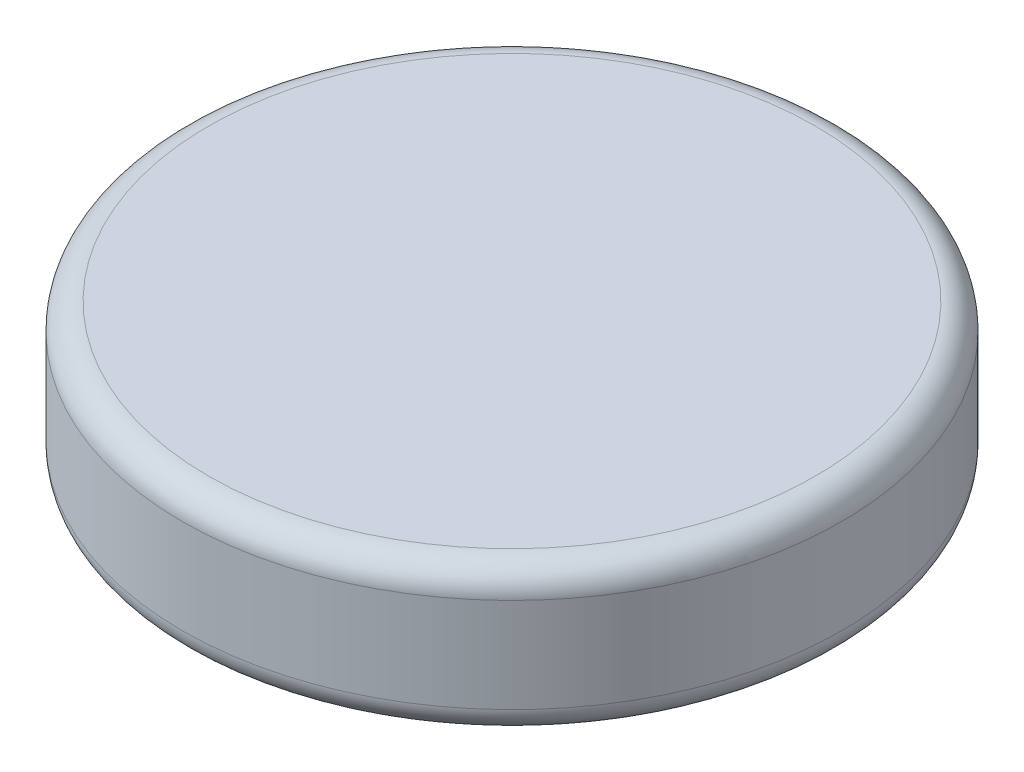
ISO-10303-21;
HEADER;
FILE_DESCRIPTION(('STEP AP214'),'2;1');
FILE_NAME('part.step','',(''),(''),'','','');
FILE_SCHEMA(('AUTOMOTIVE_DESIGN { 1 0 10303 214 1 1 1 1 }'));
ENDSEC;
DATA;
#1=APPLICATION_CONTEXT('core data for automotive mechanical design processes');
#2=APPLICATION_PROTOCOL_DEFINITION('international standard','automotive_design',2000,#1);
#3=PRODUCT_CONTEXT('',#1,'mechanical');
#4=PRODUCT('Part','Part','',(#3));
#5=PRODUCT_RELATED_PRODUCT_CATEGORY('part','',(#4));
#6=PRODUCT_DEFINITION_FORMATION('','',#4);
#7=PRODUCT_DEFINITION_CONTEXT('part definition',#1,'design');
#8=PRODUCT_DEFINITION('design','',#6,#7);
#9=PRODUCT_DEFINITION_SHAPE('','',#8);
#10=(LENGTH_UNIT() NAMED_UNIT(*) SI_UNIT(.MILLI.,.METRE.));
#11=(NAMED_UNIT(*) PLANE_ANGLE_UNIT() SI_UNIT($,.RADIAN.));
#12=(NAMED_UNIT(*) SI_UNIT($,.STERADIAN.) SOLID_ANGLE_UNIT());
#13=UNCERTAINTY_MEASURE_WITH_UNIT(LENGTH_MEASURE(1.E-05),#10,'distance_accuracy_value','');
#14=(GEOMETRIC_REPRESENTATION_CONTEXT(3) GLOBAL_UNCERTAINTY_ASSIGNED_CONTEXT((#13)) GLOBAL_UNIT_ASSIGNED_CONTEXT((#10,
#11,#12)) REPRESENTATION_CONTEXT('',''));
#15=CARTESIAN_POINT('',(0.,0.,0.));
#16=DIRECTION('',(0.,0.,1.));
#17=DIRECTION('',(1.,0.,0.));
#18=AXIS2_PLACEMENT_3D('',#15,#16,#17);
#19=CARTESIAN_POINT('',(0.,7.112,0.));
#20=DIRECTION('',(0.,-1.,0.));
#21=DIRECTION('',(0.,0.,-1.));
#22=AXIS2_PLACEMENT_3D('',#19,#20,#21);
#23=CYLINDRICAL_SURFACE('',#22,15.9385);
#24=CARTESIAN_POINT('',(0.,1.27,0.));
#25=DIRECTION('',(0.,1.,0.));
#26=DIRECTION('',(0.,0.,1.));
#27=AXIS2_PLACEMENT_3D('',#24,#25,#26);
#28=CIRCLE('',#27,15.9385);
#29=CARTESIAN_POINT('',(0.,1.27,15.9385));
#30=VERTEX_POINT('',#29);
#31=EDGE_CURVE('E55',#30,#30,#28,.T.);
#32=ORIENTED_EDGE('',*,*,#31,.T.);
#33=EDGE_LOOP('',(#32));
#34=FACE_BOUND('',#33,.T.);
#35=CARTESIAN_POINT('',(0.,5.842,0.));
#36=DIRECTION('',(0.,1.,0.));
#37=DIRECTION('',(0.,0.,1.));
#38=AXIS2_PLACEMENT_3D('',#35,#36,#37);
#39=CIRCLE('',#38,15.9385);
#40=CARTESIAN_POINT('',(0.,5.842,15.9385));
#41=VERTEX_POINT('',#40);
#42=EDGE_CURVE('E60',#41,#41,#39,.F.);
#43=ORIENTED_EDGE('',*,*,#42,.T.);
#44=EDGE_LOOP('',(#43));
#45=FACE_BOUND('',#44,.T.);
#46=ADVANCED_FACE('F42',(#34,#45),#23,.T.);
#47=CARTESIAN_POINT('',(0.,7.112,0.));
#48=DIRECTION('',(0.,1.,0.));
#49=DIRECTION('',(0.,0.,1.));
#50=AXIS2_PLACEMENT_3D('',#47,#48,#49);
#51=PLANE('',#50);
#52=CARTESIAN_POINT('',(0.,7.112,0.));
#53=DIRECTION('',(0.,1.,0.));
#54=DIRECTION('',(0.,0.,1.));
#55=AXIS2_PLACEMENT_3D('',#52,#53,#54);
#56=CIRCLE('',#55,14.6685);
#57=CARTESIAN_POINT('',(0.,7.112,14.6685));
#58=VERTEX_POINT('',#57);
#59=EDGE_CURVE('E10',#58,#58,#56,.T.);
#60=ORIENTED_EDGE('',*,*,#59,.T.);
#61=EDGE_LOOP('',(#60));
#62=FACE_BOUND('',#61,.T.);
#63=ADVANCED_FACE('F77',(#62),#51,.T.);
#64=CARTESIAN_POINT('',(0.,0.,0.));
#65=DIRECTION('',(0.,1.,0.));
#66=DIRECTION('',(0.,0.,1.));
#67=AXIS2_PLACEMENT_3D('',#64,#65,#66);
#68=PLANE('',#67);
#69=CARTESIAN_POINT('',(0.,0.,0.));
#70=DIRECTION('',(0.,1.,0.));
#71=DIRECTION('',(0.,0.,1.));
#72=AXIS2_PLACEMENT_3D('',#69,#70,#71);
#73=CIRCLE('',#72,14.6685);
#74=CARTESIAN_POINT('',(0.,0.,14.6685));
#75=VERTEX_POINT('',#74);
#76=EDGE_CURVE('E50',#75,#75,#73,.F.);
#77=ORIENTED_EDGE('',*,*,#76,.T.);
#78=EDGE_LOOP('',(#77));
#79=FACE_BOUND('',#78,.T.);
#80=ADVANCED_FACE('F74',(#79),#68,.F.);
#81=CARTESIAN_POINT('',(0.,1.27,0.));
#82=DIRECTION('',(0.,1.,0.));
#83=DIRECTION('',(0.,0.,1.));
#84=AXIS2_PLACEMENT_3D('',#81,#82,#83);
#85=TOROIDAL_SURFACE('',#84,14.6685,1.27);
#86=ORIENTED_EDGE('',*,*,#76,.F.);
#87=EDGE_LOOP('',(#86));
#88=FACE_BOUND('',#87,.T.);
#89=ORIENTED_EDGE('',*,*,#31,.F.);
#90=EDGE_LOOP('',(#89));
#91=FACE_BOUND('',#90,.T.);
#92=ADVANCED_FACE('F70',(#88,#91),#85,.T.);
#93=CARTESIAN_POINT('',(0.,5.842,0.));
#94=DIRECTION('',(0.,1.,0.));
#95=DIRECTION('',(0.,0.,1.));
#96=AXIS2_PLACEMENT_3D('',#93,#94,#95);
#97=TOROIDAL_SURFACE('',#96,14.6685,1.27);
#98=ORIENTED_EDGE('',*,*,#42,.F.);
#99=EDGE_LOOP('',(#98));
#100=FACE_BOUND('',#99,.T.);
#101=ORIENTED_EDGE('',*,*,#59,.F.);
#102=EDGE_LOOP('',(#101));
#103=FACE_BOUND('',#102,.T.);
#104=ADVANCED_FACE('F44',(#100,#103),#97,.T.);
#105=CLOSED_SHELL('',(#46,#63,#80,#92,#104));
#106=MANIFOLD_SOLID_BREP('B2',#105);
#107=ADVANCED_BREP_SHAPE_REPRESENTATION('',(#18,#106),#14);
#108=SHAPE_DEFINITION_REPRESENTATION(#9,#107);
ENDSEC;
END-ISO-10303-21;
